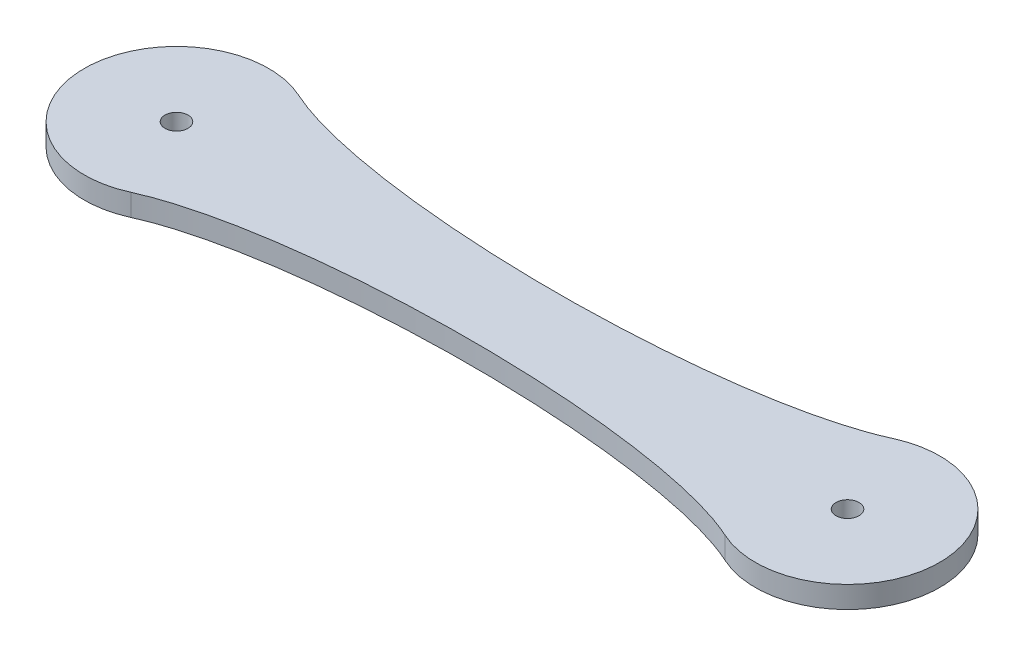
ISO-10303-21;
HEADER;
FILE_DESCRIPTION(('STEP AP214'),'2;1');
FILE_NAME('part.step','',(''),(''),'','','');
FILE_SCHEMA(('AUTOMOTIVE_DESIGN { 1 0 10303 214 1 1 1 1 }'));
ENDSEC;
DATA;
#1=APPLICATION_CONTEXT('core data for automotive mechanical design processes');
#2=APPLICATION_PROTOCOL_DEFINITION('international standard','automotive_design',2000,#1);
#3=PRODUCT_CONTEXT('',#1,'mechanical');
#4=PRODUCT('Part','Part','',(#3));
#5=PRODUCT_RELATED_PRODUCT_CATEGORY('part','',(#4));
#6=PRODUCT_DEFINITION_FORMATION('','',#4);
#7=PRODUCT_DEFINITION_CONTEXT('part definition',#1,'design');
#8=PRODUCT_DEFINITION('design','',#6,#7);
#9=PRODUCT_DEFINITION_SHAPE('','',#8);
#10=(LENGTH_UNIT() NAMED_UNIT(*) SI_UNIT(.MILLI.,.METRE.));
#11=(NAMED_UNIT(*) PLANE_ANGLE_UNIT() SI_UNIT($,.RADIAN.));
#12=(NAMED_UNIT(*) SI_UNIT($,.STERADIAN.) SOLID_ANGLE_UNIT());
#13=UNCERTAINTY_MEASURE_WITH_UNIT(LENGTH_MEASURE(1.E-05),#10,'distance_accuracy_value','');
#14=(GEOMETRIC_REPRESENTATION_CONTEXT(3) GLOBAL_UNCERTAINTY_ASSIGNED_CONTEXT((#13)) GLOBAL_UNIT_ASSIGNED_CONTEXT((#10,
#11,#12)) REPRESENTATION_CONTEXT('',''));
#15=CARTESIAN_POINT('',(0.,0.,0.));
#16=DIRECTION('',(0.,0.,1.));
#17=DIRECTION('',(1.,0.,0.));
#18=AXIS2_PLACEMENT_3D('',#15,#16,#17);
#19=CARTESIAN_POINT('',(4.58257569495584,2.6,-10.));
#20=CARTESIAN_POINT('',(11.5631499499201,2.6,-6.80109900823664));
#21=CARTESIAN_POINT('',(40.0993153532019,2.6,-3.21644303611558));
#22=CARTESIAN_POINT('',(68.3601076760309,2.6,-6.76593123442761));
#23=CARTESIAN_POINT('',(75.4174243050442,2.6,-10.));
#24=B_SPLINE_CURVE_WITH_KNOTS('',3,(#19,#20,#21,#22,#23),.UNSPECIFIED.,.F.,.F.,(4,1,4),(0.,
0.499463492323443,1.),.UNSPECIFIED.);
#25=DIRECTION('',(0.,-1.,0.));
#26=VECTOR('',#25,1.);
#27=SURFACE_OF_LINEAR_EXTRUSION('',#24,#26);
#28=CARTESIAN_POINT('',(4.58257569495584,0.,-10.));
#29=CARTESIAN_POINT('',(11.5631499499201,0.,-6.80109900823664));
#30=CARTESIAN_POINT('',(40.0993153532019,0.,-3.21644303611558));
#31=CARTESIAN_POINT('',(68.3601076760309,0.,-6.76593123442761));
#32=CARTESIAN_POINT('',(75.4174243050442,0.,-10.));
#33=B_SPLINE_CURVE_WITH_KNOTS('',3,(#28,#29,#30,#31,#32),.UNSPECIFIED.,.F.,.F.,(4,1,4),(0.,
0.499463492323443,1.),.UNSPECIFIED.);
#34=CARTESIAN_POINT('',(4.58257569495584,0.,-10.));
#35=VERTEX_POINT('',#34);
#36=CARTESIAN_POINT('',(75.4174243050442,0.,-10.));
#37=VERTEX_POINT('',#36);
#38=EDGE_CURVE('E130',#35,#37,#33,.T.);
#39=ORIENTED_EDGE('',*,*,#38,.F.);
#40=DIRECTION('',(0.,-1.,0.));
#41=VECTOR('',#40,1.);
#42=CARTESIAN_POINT('',(4.58257569495584,2.6,-10.));
#43=LINE('',#42,#41);
#44=CARTESIAN_POINT('',(4.58257569495584,2.6,-10.));
#45=VERTEX_POINT('',#44);
#46=EDGE_CURVE('E11',#45,#35,#43,.T.);
#47=ORIENTED_EDGE('',*,*,#46,.F.);
#48=CARTESIAN_POINT('',(75.4174243050442,2.6,-10.));
#49=VERTEX_POINT('',#48);
#50=EDGE_CURVE('E99',#45,#49,#24,.T.);
#51=ORIENTED_EDGE('',*,*,#50,.T.);
#52=DIRECTION('',(0.,-1.,0.));
#53=VECTOR('',#52,1.);
#54=CARTESIAN_POINT('',(75.4174243050442,2.6,-10.));
#55=LINE('',#54,#53);
#56=EDGE_CURVE('E42',#49,#37,#55,.T.);
#57=ORIENTED_EDGE('',*,*,#56,.T.);
#58=EDGE_LOOP('',(#39,#47,#51,#57));
#59=FACE_BOUND('',#58,.T.);
#60=ADVANCED_FACE('F38',(#59),#27,.T.);
#61=CARTESIAN_POINT('',(0.,2.6,0.));
#62=DIRECTION('',(0.,-1.,0.));
#63=DIRECTION('',(0.,0.,-1.));
#64=AXIS2_PLACEMENT_3D('',#61,#62,#63);
#65=CYLINDRICAL_SURFACE('',#64,11.);
#66=CARTESIAN_POINT('',(0.,0.,0.));
#67=DIRECTION('',(0.,1.,0.));
#68=DIRECTION('',(0.,0.,1.));
#69=AXIS2_PLACEMENT_3D('',#66,#67,#68);
#70=CIRCLE('',#69,11.);
#71=CARTESIAN_POINT('',(4.58257569495584,0.,10.));
#72=VERTEX_POINT('',#71);
#73=EDGE_CURVE('E72',#35,#72,#70,.T.);
#74=ORIENTED_EDGE('',*,*,#73,.T.);
#75=DIRECTION('',(0.,-1.,0.));
#76=VECTOR('',#75,1.);
#77=CARTESIAN_POINT('',(4.58257569495584,2.6,10.));
#78=LINE('',#77,#76);
#79=CARTESIAN_POINT('',(4.58257569495584,2.6,10.));
#80=VERTEX_POINT('',#79);
#81=EDGE_CURVE('E48',#80,#72,#78,.T.);
#82=ORIENTED_EDGE('',*,*,#81,.F.);
#83=CARTESIAN_POINT('',(0.,2.6,0.));
#84=DIRECTION('',(0.,1.,0.));
#85=DIRECTION('',(0.,0.,1.));
#86=AXIS2_PLACEMENT_3D('',#83,#84,#85);
#87=CIRCLE('',#86,11.);
#88=EDGE_CURVE('E87',#45,#80,#87,.T.);
#89=ORIENTED_EDGE('',*,*,#88,.F.);
#90=ORIENTED_EDGE('',*,*,#46,.T.);
#91=EDGE_LOOP('',(#74,#82,#89,#90));
#92=FACE_BOUND('',#91,.T.);
#93=ADVANCED_FACE('F116',(#92),#65,.T.);
#94=CARTESIAN_POINT('',(4.58257569495584,2.6,10.));
#95=CARTESIAN_POINT('',(11.5631499499201,2.6,6.80109900823664));
#96=CARTESIAN_POINT('',(40.0993153532019,2.6,3.21644303611558));
#97=CARTESIAN_POINT('',(68.3601076760309,2.6,6.76593123442761));
#98=CARTESIAN_POINT('',(75.4174243050442,2.6,10.));
#99=B_SPLINE_CURVE_WITH_KNOTS('',3,(#94,#95,#96,#97,#98),.UNSPECIFIED.,.F.,.F.,(4,1,4),(0.,
0.499463492323443,1.),.UNSPECIFIED.);
#100=DIRECTION('',(0.,-1.,0.));
#101=VECTOR('',#100,1.);
#102=SURFACE_OF_LINEAR_EXTRUSION('',#99,#101);
#103=CARTESIAN_POINT('',(4.58257569495584,0.,10.));
#104=CARTESIAN_POINT('',(11.5631499499201,0.,6.80109900823664));
#105=CARTESIAN_POINT('',(40.0993153532019,0.,3.21644303611558));
#106=CARTESIAN_POINT('',(68.3601076760309,0.,6.76593123442761));
#107=CARTESIAN_POINT('',(75.4174243050442,0.,10.));
#108=B_SPLINE_CURVE_WITH_KNOTS('',3,(#103,#104,#105,#106,#107),.UNSPECIFIED.,.F.,.F.,(4,1,4),
(0.,0.499463492323443,1.),.UNSPECIFIED.);
#109=CARTESIAN_POINT('',(75.4174243050442,0.,10.));
#110=VERTEX_POINT('',#109);
#111=EDGE_CURVE('E94',#72,#110,#108,.T.);
#112=ORIENTED_EDGE('',*,*,#111,.T.);
#113=DIRECTION('',(0.,-1.,0.));
#114=VECTOR('',#113,1.);
#115=CARTESIAN_POINT('',(75.4174243050442,2.6,10.));
#116=LINE('',#115,#114);
#117=CARTESIAN_POINT('',(75.4174243050442,2.6,10.));
#118=VERTEX_POINT('',#117);
#119=EDGE_CURVE('E91',#118,#110,#116,.T.);
#120=ORIENTED_EDGE('',*,*,#119,.F.);
#121=EDGE_CURVE('E84',#80,#118,#99,.T.);
#122=ORIENTED_EDGE('',*,*,#121,.F.);
#123=ORIENTED_EDGE('',*,*,#81,.T.);
#124=EDGE_LOOP('',(#112,#120,#122,#123));
#125=FACE_BOUND('',#124,.T.);
#126=ADVANCED_FACE('F92',(#125),#102,.F.);
#127=CARTESIAN_POINT('',(80.,2.6,0.));
#128=DIRECTION('',(0.,-1.,0.));
#129=DIRECTION('',(0.,0.,-1.));
#130=AXIS2_PLACEMENT_3D('',#127,#128,#129);
#131=CYLINDRICAL_SURFACE('',#130,11.);
#132=CARTESIAN_POINT('',(80.,0.,0.));
#133=DIRECTION('',(0.,1.,0.));
#134=DIRECTION('',(0.,0.,1.));
#135=AXIS2_PLACEMENT_3D('',#132,#133,#134);
#136=CIRCLE('',#135,11.);
#137=EDGE_CURVE('E132',#110,#37,#136,.T.);
#138=ORIENTED_EDGE('',*,*,#137,.T.);
#139=ORIENTED_EDGE('',*,*,#56,.F.);
#140=CARTESIAN_POINT('',(80.,2.6,0.));
#141=DIRECTION('',(0.,1.,0.));
#142=DIRECTION('',(0.,0.,1.));
#143=AXIS2_PLACEMENT_3D('',#140,#141,#142);
#144=CIRCLE('',#143,11.);
#145=EDGE_CURVE('E81',#118,#49,#144,.T.);
#146=ORIENTED_EDGE('',*,*,#145,.F.);
#147=ORIENTED_EDGE('',*,*,#119,.T.);
#148=EDGE_LOOP('',(#138,#139,#146,#147));
#149=FACE_BOUND('',#148,.T.);
#150=ADVANCED_FACE('F98',(#149),#131,.T.);
#151=CARTESIAN_POINT('',(40.0457079970938,2.6,-4.99997169792276));
#152=DIRECTION('',(0.,-1.,0.));
#153=DIRECTION('',(0.,0.,-1.));
#154=AXIS2_PLACEMENT_3D('',#151,#152,#153);
#155=PLANE('',#154);
#156=CARTESIAN_POINT('',(80.,2.6,0.));
#157=DIRECTION('',(0.,1.,0.));
#158=DIRECTION('',(0.,0.,1.));
#159=AXIS2_PLACEMENT_3D('',#156,#157,#158);
#160=CIRCLE('',#159,1.375);
#161=CARTESIAN_POINT('',(80.,2.6,1.375));
#162=VERTEX_POINT('',#161);
#163=EDGE_CURVE('E133',#162,#162,#160,.T.);
#164=ORIENTED_EDGE('',*,*,#163,.F.);
#165=EDGE_LOOP('',(#164));
#166=FACE_BOUND('',#165,.T.);
#167=CARTESIAN_POINT('',(0.,2.6,0.));
#168=DIRECTION('',(0.,1.,0.));
#169=DIRECTION('',(0.,0.,1.));
#170=AXIS2_PLACEMENT_3D('',#167,#168,#169);
#171=CIRCLE('',#170,1.375);
#172=CARTESIAN_POINT('',(0.,2.6,1.375));
#173=VERTEX_POINT('',#172);
#174=EDGE_CURVE('E173',#173,#173,#171,.T.);
#175=ORIENTED_EDGE('',*,*,#174,.F.);
#176=EDGE_LOOP('',(#175));
#177=FACE_BOUND('',#176,.T.);
#178=ORIENTED_EDGE('',*,*,#50,.F.);
#179=ORIENTED_EDGE('',*,*,#88,.T.);
#180=ORIENTED_EDGE('',*,*,#121,.T.);
#181=ORIENTED_EDGE('',*,*,#145,.T.);
#182=EDGE_LOOP('',(#178,#179,#180,#181));
#183=FACE_BOUND('',#182,.T.);
#184=ADVANCED_FACE('F86',(#166,#177,#183),#155,.F.);
#185=CARTESIAN_POINT('',(40.0457079970938,0.,-4.99997169792276));
#186=DIRECTION('',(0.,-1.,0.));
#187=DIRECTION('',(0.,0.,-1.));
#188=AXIS2_PLACEMENT_3D('',#185,#186,#187);
#189=PLANE('',#188);
#190=CARTESIAN_POINT('',(80.,0.,0.));
#191=DIRECTION('',(0.,-1.,0.));
#192=DIRECTION('',(0.,0.,-1.));
#193=AXIS2_PLACEMENT_3D('',#190,#191,#192);
#194=CIRCLE('',#193,1.375);
#195=CARTESIAN_POINT('',(80.,0.,-1.375));
#196=VERTEX_POINT('',#195);
#197=EDGE_CURVE('E136',#196,#196,#194,.F.);
#198=ORIENTED_EDGE('',*,*,#197,.T.);
#199=EDGE_LOOP('',(#198));
#200=FACE_BOUND('',#199,.T.);
#201=CARTESIAN_POINT('',(0.,0.,0.));
#202=DIRECTION('',(0.,-1.,0.));
#203=DIRECTION('',(0.,0.,-1.));
#204=AXIS2_PLACEMENT_3D('',#201,#202,#203);
#205=CIRCLE('',#204,1.375);
#206=CARTESIAN_POINT('',(0.,0.,-1.375));
#207=VERTEX_POINT('',#206);
#208=EDGE_CURVE('E175',#207,#207,#205,.F.);
#209=ORIENTED_EDGE('',*,*,#208,.T.);
#210=EDGE_LOOP('',(#209));
#211=FACE_BOUND('',#210,.T.);
#212=ORIENTED_EDGE('',*,*,#38,.T.);
#213=ORIENTED_EDGE('',*,*,#137,.F.);
#214=ORIENTED_EDGE('',*,*,#111,.F.);
#215=ORIENTED_EDGE('',*,*,#73,.F.);
#216=EDGE_LOOP('',(#212,#213,#214,#215));
#217=FACE_BOUND('',#216,.T.);
#218=ADVANCED_FACE('F122',(#200,#211,#217),#189,.T.);
#219=CARTESIAN_POINT('',(0.,-0.00100000000000013,0.));
#220=DIRECTION('',(0.,1.,0.));
#221=DIRECTION('',(0.,0.,1.));
#222=AXIS2_PLACEMENT_3D('',#219,#220,#221);
#223=CYLINDRICAL_SURFACE('',#222,1.375);
#224=ORIENTED_EDGE('',*,*,#208,.F.);
#225=EDGE_LOOP('',(#224));
#226=FACE_BOUND('',#225,.T.);
#227=ORIENTED_EDGE('',*,*,#174,.T.);
#228=EDGE_LOOP('',(#227));
#229=FACE_BOUND('',#228,.T.);
#230=ADVANCED_FACE('F152',(#226,#229),#223,.F.);
#231=CARTESIAN_POINT('',(80.,-0.00100000000000013,0.));
#232=DIRECTION('',(0.,1.,0.));
#233=DIRECTION('',(0.,0.,1.));
#234=AXIS2_PLACEMENT_3D('',#231,#232,#233);
#235=CYLINDRICAL_SURFACE('',#234,1.375);
#236=ORIENTED_EDGE('',*,*,#197,.F.);
#237=EDGE_LOOP('',(#236));
#238=FACE_BOUND('',#237,.T.);
#239=ORIENTED_EDGE('',*,*,#163,.T.);
#240=EDGE_LOOP('',(#239));
#241=FACE_BOUND('',#240,.T.);
#242=ADVANCED_FACE('F157',(#238,#241),#235,.F.);
#243=CLOSED_SHELL('',(#60,#93,#126,#150,#184,#218,#230,#242));
#244=MANIFOLD_SOLID_BREP('B2',#243);
#245=ADVANCED_BREP_SHAPE_REPRESENTATION('',(#18,#244),#14);
#246=SHAPE_DEFINITION_REPRESENTATION(#9,#245);
ENDSEC;
END-ISO-10303-21;
